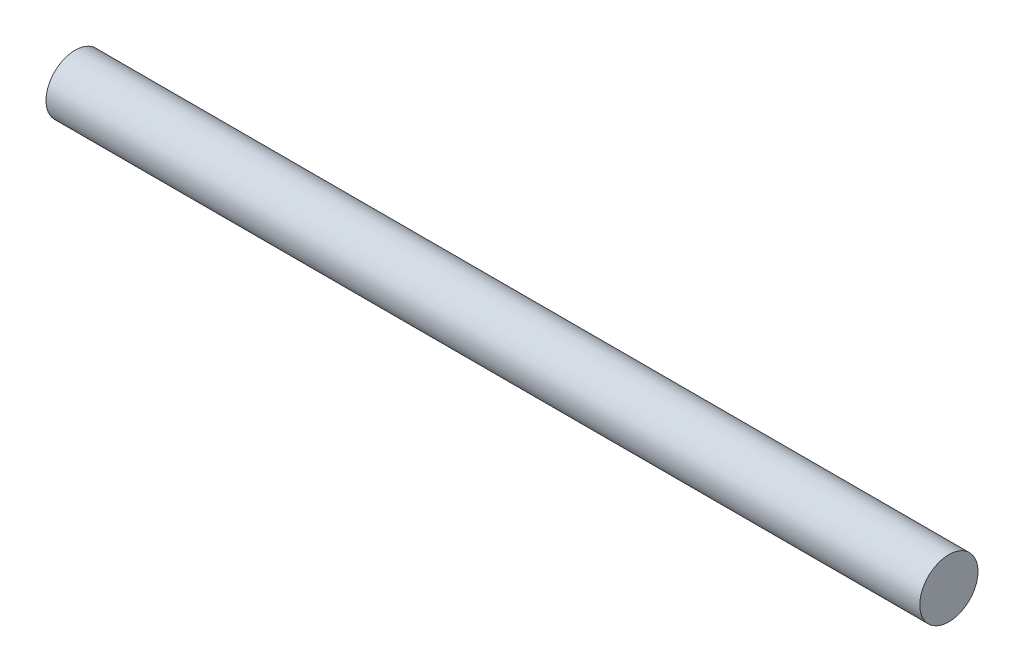
ISO-10303-21;
HEADER;
FILE_DESCRIPTION(('STEP AP214'),'2;1');
FILE_NAME('part.step','',(''),(''),'','','');
FILE_SCHEMA(('AUTOMOTIVE_DESIGN { 1 0 10303 214 1 1 1 1 }'));
ENDSEC;
DATA;
#1=APPLICATION_CONTEXT('core data for automotive mechanical design processes');
#2=APPLICATION_PROTOCOL_DEFINITION('international standard','automotive_design',2000,#1);
#3=PRODUCT_CONTEXT('',#1,'mechanical');
#4=PRODUCT('Part','Part','',(#3));
#5=PRODUCT_RELATED_PRODUCT_CATEGORY('part','',(#4));
#6=PRODUCT_DEFINITION_FORMATION('','',#4);
#7=PRODUCT_DEFINITION_CONTEXT('part definition',#1,'design');
#8=PRODUCT_DEFINITION('design','',#6,#7);
#9=PRODUCT_DEFINITION_SHAPE('','',#8);
#10=(LENGTH_UNIT() NAMED_UNIT(*) SI_UNIT(.MILLI.,.METRE.));
#11=(NAMED_UNIT(*) PLANE_ANGLE_UNIT() SI_UNIT($,.RADIAN.));
#12=(NAMED_UNIT(*) SI_UNIT($,.STERADIAN.) SOLID_ANGLE_UNIT());
#13=UNCERTAINTY_MEASURE_WITH_UNIT(LENGTH_MEASURE(1.E-05),#10,'distance_accuracy_value','');
#14=(GEOMETRIC_REPRESENTATION_CONTEXT(3) GLOBAL_UNCERTAINTY_ASSIGNED_CONTEXT((#13)) GLOBAL_UNIT_ASSIGNED_CONTEXT((#10,
#11,#12)) REPRESENTATION_CONTEXT('',''));
#15=CARTESIAN_POINT('',(0.,0.,0.));
#16=DIRECTION('',(0.,0.,1.));
#17=DIRECTION('',(1.,0.,0.));
#18=AXIS2_PLACEMENT_3D('',#15,#16,#17);
#19=CARTESIAN_POINT('',(0.,0.,0.));
#20=DIRECTION('',(-1.,0.,0.));
#21=DIRECTION('',(0.,-1.,0.));
#22=AXIS2_PLACEMENT_3D('',#19,#20,#21);
#23=PLANE('',#22);
#24=CARTESIAN_POINT('',(0.,4.,0.));
#25=DIRECTION('',(1.,0.,0.));
#26=DIRECTION('',(0.,1.,0.));
#27=AXIS2_PLACEMENT_3D('',#24,#25,#26);
#28=CIRCLE('',#27,4.);
#29=CARTESIAN_POINT('',(0.,8.,0.));
#30=VERTEX_POINT('',#29);
#31=EDGE_CURVE('E37',#30,#30,#28,.T.);
#32=ORIENTED_EDGE('',*,*,#31,.T.);
#33=EDGE_LOOP('',(#32));
#34=FACE_BOUND('',#33,.T.);
#35=ADVANCED_FACE('F31',(#34),#23,.F.);
#36=CARTESIAN_POINT('',(-120.,0.,0.));
#37=DIRECTION('',(1.,0.,0.));
#38=DIRECTION('',(0.,1.,0.));
#39=AXIS2_PLACEMENT_3D('',#36,#37,#38);
#40=PLANE('',#39);
#41=CARTESIAN_POINT('',(-120.,4.,0.));
#42=DIRECTION('',(1.,0.,0.));
#43=DIRECTION('',(0.,1.,0.));
#44=AXIS2_PLACEMENT_3D('',#41,#42,#43);
#45=CIRCLE('',#44,4.);
#46=CARTESIAN_POINT('',(-120.,8.,0.));
#47=VERTEX_POINT('',#46);
#48=EDGE_CURVE('E10',#47,#47,#45,.T.);
#49=ORIENTED_EDGE('',*,*,#48,.F.);
#50=EDGE_LOOP('',(#49));
#51=FACE_BOUND('',#50,.T.);
#52=ADVANCED_FACE('F46',(#51),#40,.F.);
#53=CARTESIAN_POINT('',(0.,4.,0.));
#54=DIRECTION('',(1.,0.,0.));
#55=DIRECTION('',(0.,1.,0.));
#56=AXIS2_PLACEMENT_3D('',#53,#54,#55);
#57=CYLINDRICAL_SURFACE('',#56,4.);
#58=ORIENTED_EDGE('',*,*,#31,.F.);
#59=EDGE_LOOP('',(#58));
#60=FACE_BOUND('',#59,.T.);
#61=ORIENTED_EDGE('',*,*,#48,.T.);
#62=EDGE_LOOP('',(#61));
#63=FACE_BOUND('',#62,.T.);
#64=ADVANCED_FACE('F44',(#60,#63),#57,.T.);
#65=CLOSED_SHELL('',(#35,#52,#64));
#66=MANIFOLD_SOLID_BREP('B2',#65);
#67=ADVANCED_BREP_SHAPE_REPRESENTATION('',(#18,#66),#14);
#68=SHAPE_DEFINITION_REPRESENTATION(#9,#67);
ENDSEC;
END-ISO-10303-21;
